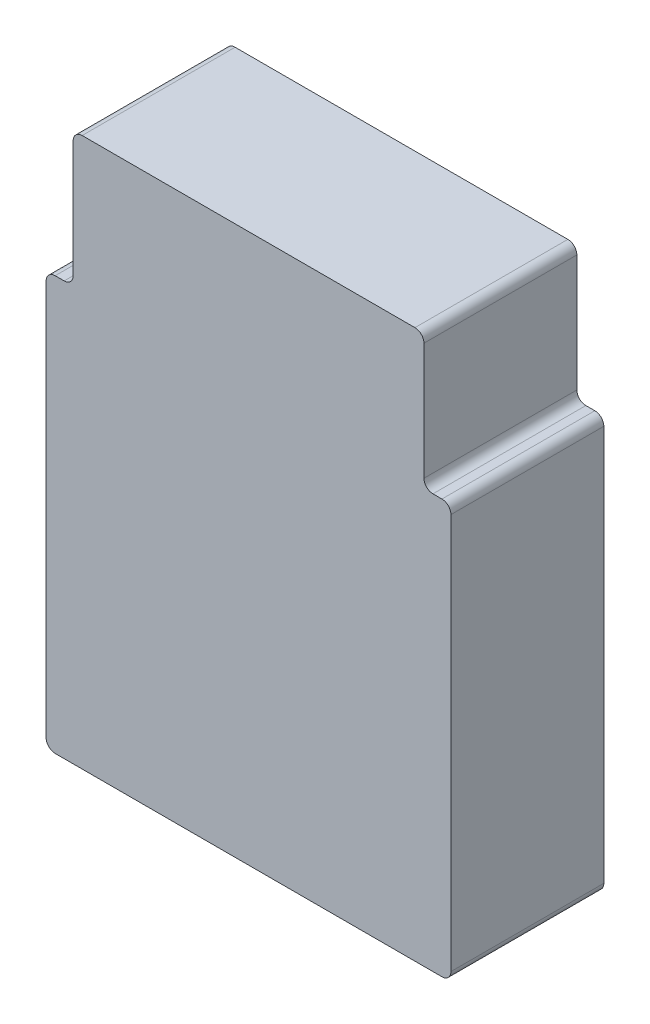
ISO-10303-21;
HEADER;
FILE_DESCRIPTION(('STEP AP214'),'2;1');
FILE_NAME('part.step','',(''),(''),'','','');
FILE_SCHEMA(('AUTOMOTIVE_DESIGN { 1 0 10303 214 1 1 1 1 }'));
ENDSEC;
DATA;
#1=APPLICATION_CONTEXT('core data for automotive mechanical design processes');
#2=APPLICATION_PROTOCOL_DEFINITION('international standard','automotive_design',2000,#1);
#3=PRODUCT_CONTEXT('',#1,'mechanical');
#4=PRODUCT('Part','Part','',(#3));
#5=PRODUCT_RELATED_PRODUCT_CATEGORY('part','',(#4));
#6=PRODUCT_DEFINITION_FORMATION('','',#4);
#7=PRODUCT_DEFINITION_CONTEXT('part definition',#1,'design');
#8=PRODUCT_DEFINITION('design','',#6,#7);
#9=PRODUCT_DEFINITION_SHAPE('','',#8);
#10=(LENGTH_UNIT() NAMED_UNIT(*) SI_UNIT(.MILLI.,.METRE.));
#11=(NAMED_UNIT(*) PLANE_ANGLE_UNIT() SI_UNIT($,.RADIAN.));
#12=(NAMED_UNIT(*) SI_UNIT($,.STERADIAN.) SOLID_ANGLE_UNIT());
#13=UNCERTAINTY_MEASURE_WITH_UNIT(LENGTH_MEASURE(1.E-05),#10,'distance_accuracy_value','');
#14=(GEOMETRIC_REPRESENTATION_CONTEXT(3) GLOBAL_UNCERTAINTY_ASSIGNED_CONTEXT((#13)) GLOBAL_UNIT_ASSIGNED_CONTEXT((#10,
#11,#12)) REPRESENTATION_CONTEXT('',''));
#15=CARTESIAN_POINT('',(0.,0.,0.));
#16=DIRECTION('',(0.,0.,1.));
#17=DIRECTION('',(1.,0.,0.));
#18=AXIS2_PLACEMENT_3D('',#15,#16,#17);
#19=CARTESIAN_POINT('',(1.95,0.,0.85));
#20=DIRECTION('',(1.,0.,0.));
#21=DIRECTION('',(0.,0.,-1.));
#22=AXIS2_PLACEMENT_3D('',#19,#20,#21);
#23=PLANE('',#22);
#24=DIRECTION('',(0.,-1.,0.));
#25=VECTOR('',#24,1.);
#26=CARTESIAN_POINT('',(1.95,0.,0.85));
#27=LINE('',#26,#25);
#28=CARTESIAN_POINT('',(1.95,0.65,0.85));
#29=VERTEX_POINT('',#28);
#30=CARTESIAN_POINT('',(1.95,-0.650000000000001,0.85));
#31=VERTEX_POINT('',#30);
#32=EDGE_CURVE('E293',#29,#31,#27,.T.);
#33=ORIENTED_EDGE('',*,*,#32,.T.);
#34=DIRECTION('',(0.,0.,-1.));
#35=VECTOR('',#34,1.);
#36=CARTESIAN_POINT('',(1.95,-0.650000000000001,-0.85));
#37=LINE('',#36,#35);
#38=CARTESIAN_POINT('',(1.95,-0.650000000000001,-0.85));
#39=VERTEX_POINT('',#38);
#40=EDGE_CURVE('E177',#31,#39,#37,.T.);
#41=ORIENTED_EDGE('',*,*,#40,.T.);
#42=DIRECTION('',(0.,-1.,0.));
#43=VECTOR('',#42,1.);
#44=CARTESIAN_POINT('',(1.95,0.,-0.85));
#45=LINE('',#44,#43);
#46=CARTESIAN_POINT('',(1.95,0.65,-0.85));
#47=VERTEX_POINT('',#46);
#48=EDGE_CURVE('E161',#47,#39,#45,.T.);
#49=ORIENTED_EDGE('',*,*,#48,.F.);
#50=DIRECTION('',(0.,0.,-1.));
#51=VECTOR('',#50,1.);
#52=CARTESIAN_POINT('',(1.95,0.65,0.85));
#53=LINE('',#52,#51);
#54=EDGE_CURVE('E174',#47,#29,#53,.F.);
#55=ORIENTED_EDGE('',*,*,#54,.T.);
#56=EDGE_LOOP('',(#33,#41,#49,#55));
#57=FACE_BOUND('',#56,.T.);
#58=ADVANCED_FACE('F43',(#57),#23,.T.);
#59=CARTESIAN_POINT('',(0.,0.75,0.85));
#60=DIRECTION('',(0.,1.,0.));
#61=DIRECTION('',(0.,0.,1.));
#62=AXIS2_PLACEMENT_3D('',#59,#60,#61);
#63=PLANE('',#62);
#64=DIRECTION('',(1.,0.,0.));
#65=VECTOR('',#64,1.);
#66=CARTESIAN_POINT('',(0.,0.75,-0.85));
#67=LINE('',#66,#65);
#68=CARTESIAN_POINT('',(-1.85,0.75,-0.85));
#69=VERTEX_POINT('',#68);
#70=CARTESIAN_POINT('',(1.85,0.75,-0.85));
#71=VERTEX_POINT('',#70);
#72=EDGE_CURVE('E163',#69,#71,#67,.T.);
#73=ORIENTED_EDGE('',*,*,#72,.F.);
#74=DIRECTION('',(0.,0.,-1.));
#75=VECTOR('',#74,1.);
#76=CARTESIAN_POINT('',(-1.85,0.75,0.85));
#77=LINE('',#76,#75);
#78=CARTESIAN_POINT('',(-1.85,0.75,0.85));
#79=VERTEX_POINT('',#78);
#80=EDGE_CURVE('E241',#69,#79,#77,.F.);
#81=ORIENTED_EDGE('',*,*,#80,.T.);
#82=DIRECTION('',(1.,0.,0.));
#83=VECTOR('',#82,1.);
#84=CARTESIAN_POINT('',(0.,0.75,0.85));
#85=LINE('',#84,#83);
#86=CARTESIAN_POINT('',(1.85,0.75,0.85));
#87=VERTEX_POINT('',#86);
#88=EDGE_CURVE('E276',#79,#87,#85,.T.);
#89=ORIENTED_EDGE('',*,*,#88,.T.);
#90=DIRECTION('',(0.,0.,-1.));
#91=VECTOR('',#90,1.);
#92=CARTESIAN_POINT('',(1.85,0.75,0.85));
#93=LINE('',#92,#91);
#94=EDGE_CURVE('E239',#87,#71,#93,.T.);
#95=ORIENTED_EDGE('',*,*,#94,.T.);
#96=EDGE_LOOP('',(#73,#81,#89,#95));
#97=FACE_BOUND('',#96,.T.);
#98=ADVANCED_FACE('F299',(#97),#63,.T.);
#99=CARTESIAN_POINT('',(-1.95,0.,0.85));
#100=DIRECTION('',(1.,0.,0.));
#101=DIRECTION('',(0.,0.,-1.));
#102=AXIS2_PLACEMENT_3D('',#99,#100,#101);
#103=PLANE('',#102);
#104=DIRECTION('',(0.,-1.,0.));
#105=VECTOR('',#104,1.);
#106=CARTESIAN_POINT('',(-1.95,0.,-0.85));
#107=LINE('',#106,#105);
#108=CARTESIAN_POINT('',(-1.95,0.65,-0.85));
#109=VERTEX_POINT('',#108);
#110=CARTESIAN_POINT('',(-1.95,-0.65,-0.85));
#111=VERTEX_POINT('',#110);
#112=EDGE_CURVE('E249',#109,#111,#107,.T.);
#113=ORIENTED_EDGE('',*,*,#112,.T.);
#114=DIRECTION('',(0.,0.,-1.));
#115=VECTOR('',#114,1.);
#116=CARTESIAN_POINT('',(-1.95,-0.65,0.85));
#117=LINE('',#116,#115);
#118=CARTESIAN_POINT('',(-1.95,-0.65,0.85));
#119=VERTEX_POINT('',#118);
#120=EDGE_CURVE('E237',#111,#119,#117,.F.);
#121=ORIENTED_EDGE('',*,*,#120,.T.);
#122=DIRECTION('',(0.,-1.,0.));
#123=VECTOR('',#122,1.);
#124=CARTESIAN_POINT('',(-1.95,0.,0.85));
#125=LINE('',#124,#123);
#126=CARTESIAN_POINT('',(-1.95,0.65,0.85));
#127=VERTEX_POINT('',#126);
#128=EDGE_CURVE('E268',#127,#119,#125,.T.);
#129=ORIENTED_EDGE('',*,*,#128,.F.);
#130=DIRECTION('',(0.,0.,-1.));
#131=VECTOR('',#130,1.);
#132=CARTESIAN_POINT('',(-1.95,0.65,-0.85));
#133=LINE('',#132,#131);
#134=EDGE_CURVE('E234',#127,#109,#133,.T.);
#135=ORIENTED_EDGE('',*,*,#134,.T.);
#136=EDGE_LOOP('',(#113,#121,#129,#135));
#137=FACE_BOUND('',#136,.T.);
#138=ADVANCED_FACE('F256',(#137),#103,.F.);
#139=CARTESIAN_POINT('',(0.,-0.750000000000001,0.85));
#140=DIRECTION('',(0.,1.,0.));
#141=DIRECTION('',(-1.,0.,0.));
#142=AXIS2_PLACEMENT_3D('',#139,#140,#141);
#143=PLANE('',#142);
#144=DIRECTION('',(1.,0.,0.));
#145=VECTOR('',#144,1.);
#146=CARTESIAN_POINT('',(0.,-0.750000000000001,-0.85));
#147=LINE('',#146,#145);
#148=CARTESIAN_POINT('',(-2.15,-0.750000000000001,-0.85));
#149=VERTEX_POINT('',#148);
#150=CARTESIAN_POINT('',(-2.05,-0.750000000000001,-0.85));
#151=VERTEX_POINT('',#150);
#152=EDGE_CURVE('E251',#149,#151,#147,.T.);
#153=ORIENTED_EDGE('',*,*,#152,.F.);
#154=DIRECTION('',(0.,0.,-1.));
#155=VECTOR('',#154,1.);
#156=CARTESIAN_POINT('',(-2.15,-0.750000000000001,0.85));
#157=LINE('',#156,#155);
#158=CARTESIAN_POINT('',(-2.15,-0.750000000000001,0.85));
#159=VERTEX_POINT('',#158);
#160=EDGE_CURVE('E232',#149,#159,#157,.F.);
#161=ORIENTED_EDGE('',*,*,#160,.T.);
#162=DIRECTION('',(1.,0.,0.));
#163=VECTOR('',#162,1.);
#164=CARTESIAN_POINT('',(0.,-0.750000000000001,0.85));
#165=LINE('',#164,#163);
#166=CARTESIAN_POINT('',(-2.05,-0.750000000000001,0.85));
#167=VERTEX_POINT('',#166);
#168=EDGE_CURVE('E188',#159,#167,#165,.T.);
#169=ORIENTED_EDGE('',*,*,#168,.T.);
#170=DIRECTION('',(0.,0.,-1.));
#171=VECTOR('',#170,1.);
#172=CARTESIAN_POINT('',(-2.05,-0.750000000000001,0.85));
#173=LINE('',#172,#171);
#174=EDGE_CURVE('E229',#167,#151,#173,.T.);
#175=ORIENTED_EDGE('',*,*,#174,.T.);
#176=EDGE_LOOP('',(#153,#161,#169,#175));
#177=FACE_BOUND('',#176,.T.);
#178=ADVANCED_FACE('F270',(#177),#143,.T.);
#179=CARTESIAN_POINT('',(-2.25,0.,0.85));
#180=DIRECTION('',(-1.,0.,0.));
#181=DIRECTION('',(0.,0.,1.));
#182=AXIS2_PLACEMENT_3D('',#179,#180,#181);
#183=PLANE('',#182);
#184=DIRECTION('',(0.,1.,0.));
#185=VECTOR('',#184,1.);
#186=CARTESIAN_POINT('',(-2.25,0.,-0.85));
#187=LINE('',#186,#185);
#188=CARTESIAN_POINT('',(-2.25,-5.25,-0.85));
#189=VERTEX_POINT('',#188);
#190=CARTESIAN_POINT('',(-2.25,-0.850000000000001,-0.85));
#191=VERTEX_POINT('',#190);
#192=EDGE_CURVE('E284',#189,#191,#187,.T.);
#193=ORIENTED_EDGE('',*,*,#192,.F.);
#194=DIRECTION('',(0.,0.,-1.));
#195=VECTOR('',#194,1.);
#196=CARTESIAN_POINT('',(-2.25,-5.25,0.85));
#197=LINE('',#196,#195);
#198=CARTESIAN_POINT('',(-2.25,-5.25,0.85));
#199=VERTEX_POINT('',#198);
#200=EDGE_CURVE('E227',#189,#199,#197,.F.);
#201=ORIENTED_EDGE('',*,*,#200,.T.);
#202=DIRECTION('',(0.,1.,0.));
#203=VECTOR('',#202,1.);
#204=CARTESIAN_POINT('',(-2.25,0.,0.85));
#205=LINE('',#204,#203);
#206=CARTESIAN_POINT('',(-2.25,-0.850000000000001,0.85));
#207=VERTEX_POINT('',#206);
#208=EDGE_CURVE('E272',#199,#207,#205,.T.);
#209=ORIENTED_EDGE('',*,*,#208,.T.);
#210=DIRECTION('',(0.,0.,-1.));
#211=VECTOR('',#210,1.);
#212=CARTESIAN_POINT('',(-2.25,-0.850000000000001,0.85));
#213=LINE('',#212,#211);
#214=EDGE_CURVE('E224',#207,#191,#213,.T.);
#215=ORIENTED_EDGE('',*,*,#214,.T.);
#216=EDGE_LOOP('',(#193,#201,#209,#215));
#217=FACE_BOUND('',#216,.T.);
#218=ADVANCED_FACE('F342',(#217),#183,.T.);
#219=CARTESIAN_POINT('',(0.,-5.35,0.85));
#220=DIRECTION('',(0.,1.,0.));
#221=DIRECTION('',(-1.,0.,0.));
#222=AXIS2_PLACEMENT_3D('',#219,#220,#221);
#223=PLANE('',#222);
#224=DIRECTION('',(1.,0.,0.));
#225=VECTOR('',#224,1.);
#226=CARTESIAN_POINT('',(0.,-5.35,-0.85));
#227=LINE('',#226,#225);
#228=CARTESIAN_POINT('',(-2.15,-5.35,-0.85));
#229=VERTEX_POINT('',#228);
#230=CARTESIAN_POINT('',(2.15,-5.35,-0.85));
#231=VERTEX_POINT('',#230);
#232=EDGE_CURVE('E287',#229,#231,#227,.T.);
#233=ORIENTED_EDGE('',*,*,#232,.T.);
#234=DIRECTION('',(0.,0.,-1.));
#235=VECTOR('',#234,1.);
#236=CARTESIAN_POINT('',(2.15,-5.35,0.85));
#237=LINE('',#236,#235);
#238=CARTESIAN_POINT('',(2.15,-5.35,0.85));
#239=VERTEX_POINT('',#238);
#240=EDGE_CURVE('E58',#231,#239,#237,.F.);
#241=ORIENTED_EDGE('',*,*,#240,.T.);
#242=DIRECTION('',(1.,0.,0.));
#243=VECTOR('',#242,1.);
#244=CARTESIAN_POINT('',(0.,-5.35,0.85));
#245=LINE('',#244,#243);
#246=CARTESIAN_POINT('',(-2.15,-5.35,0.85));
#247=VERTEX_POINT('',#246);
#248=EDGE_CURVE('E274',#247,#239,#245,.T.);
#249=ORIENTED_EDGE('',*,*,#248,.F.);
#250=DIRECTION('',(0.,0.,-1.));
#251=VECTOR('',#250,1.);
#252=CARTESIAN_POINT('',(-2.15,-5.35,-0.85));
#253=LINE('',#252,#251);
#254=EDGE_CURVE('E220',#247,#229,#253,.T.);
#255=ORIENTED_EDGE('',*,*,#254,.T.);
#256=EDGE_LOOP('',(#233,#241,#249,#255));
#257=FACE_BOUND('',#256,.T.);
#258=ADVANCED_FACE('F345',(#257),#223,.F.);
#259=CARTESIAN_POINT('',(2.25,0.,0.85));
#260=DIRECTION('',(-1.,0.,0.));
#261=DIRECTION('',(0.,0.,1.));
#262=AXIS2_PLACEMENT_3D('',#259,#260,#261);
#263=PLANE('',#262);
#264=DIRECTION('',(0.,1.,0.));
#265=VECTOR('',#264,1.);
#266=CARTESIAN_POINT('',(2.25,0.,-0.85));
#267=LINE('',#266,#265);
#268=CARTESIAN_POINT('',(2.25,-5.25,-0.85));
#269=VERTEX_POINT('',#268);
#270=CARTESIAN_POINT('',(2.25,-0.850000000000001,-0.85));
#271=VERTEX_POINT('',#270);
#272=EDGE_CURVE('E190',#269,#271,#267,.T.);
#273=ORIENTED_EDGE('',*,*,#272,.T.);
#274=DIRECTION('',(0.,0.,-1.));
#275=VECTOR('',#274,1.);
#276=CARTESIAN_POINT('',(2.25,-0.850000000000001,0.85));
#277=LINE('',#276,#275);
#278=CARTESIAN_POINT('',(2.25,-0.850000000000001,0.85));
#279=VERTEX_POINT('',#278);
#280=EDGE_CURVE('E208',#271,#279,#277,.F.);
#281=ORIENTED_EDGE('',*,*,#280,.T.);
#282=DIRECTION('',(0.,1.,0.));
#283=VECTOR('',#282,1.);
#284=CARTESIAN_POINT('',(2.25,0.,0.85));
#285=LINE('',#284,#283);
#286=CARTESIAN_POINT('',(2.25,-5.25,0.85));
#287=VERTEX_POINT('',#286);
#288=EDGE_CURVE('E186',#287,#279,#285,.T.);
#289=ORIENTED_EDGE('',*,*,#288,.F.);
#290=DIRECTION('',(0.,0.,-1.));
#291=VECTOR('',#290,1.);
#292=CARTESIAN_POINT('',(2.25,-5.25,0.85));
#293=LINE('',#292,#291);
#294=EDGE_CURVE('E205',#287,#269,#293,.T.);
#295=ORIENTED_EDGE('',*,*,#294,.T.);
#296=EDGE_LOOP('',(#273,#281,#289,#295));
#297=FACE_BOUND('',#296,.T.);
#298=ADVANCED_FACE('F349',(#297),#263,.F.);
#299=CARTESIAN_POINT('',(2.05,-0.750000000000001,-0.85));
#300=VERTEX_POINT('',#299);
#301=CARTESIAN_POINT('',(2.15,-0.750000000000001,-0.85));
#302=VERTEX_POINT('',#301);
#303=EDGE_CURVE('E285',#300,#302,#147,.T.);
#304=ORIENTED_EDGE('',*,*,#303,.F.);
#305=DIRECTION('',(0.,0.,-1.));
#306=VECTOR('',#305,1.);
#307=CARTESIAN_POINT('',(2.05,-0.750000000000001,0.85));
#308=LINE('',#307,#306);
#309=CARTESIAN_POINT('',(2.05,-0.750000000000001,0.85));
#310=VERTEX_POINT('',#309);
#311=EDGE_CURVE('E169',#300,#310,#308,.F.);
#312=ORIENTED_EDGE('',*,*,#311,.T.);
#313=CARTESIAN_POINT('',(2.15,-0.750000000000001,0.85));
#314=VERTEX_POINT('',#313);
#315=EDGE_CURVE('E181',#310,#314,#165,.T.);
#316=ORIENTED_EDGE('',*,*,#315,.T.);
#317=DIRECTION('',(0.,0.,-1.));
#318=VECTOR('',#317,1.);
#319=CARTESIAN_POINT('',(2.15,-0.750000000000001,-0.85));
#320=LINE('',#319,#318);
#321=EDGE_CURVE('E183',#314,#302,#320,.T.);
#322=ORIENTED_EDGE('',*,*,#321,.T.);
#323=EDGE_LOOP('',(#304,#312,#316,#322));
#324=FACE_BOUND('',#323,.T.);
#325=ADVANCED_FACE('F354',(#324),#143,.T.);
#326=CARTESIAN_POINT('',(0.,0.,0.85));
#327=DIRECTION('',(0.,0.,1.));
#328=DIRECTION('',(1.,0.,0.));
#329=AXIS2_PLACEMENT_3D('',#326,#327,#328);
#330=PLANE('',#329);
#331=ORIENTED_EDGE('',*,*,#288,.T.);
#332=CARTESIAN_POINT('',(2.15,-0.850000000000001,0.85));
#333=DIRECTION('',(0.,0.,1.));
#334=DIRECTION('',(1.,0.,0.));
#335=AXIS2_PLACEMENT_3D('',#332,#333,#334);
#336=CIRCLE('',#335,0.1);
#337=EDGE_CURVE('E218',#279,#314,#336,.T.);
#338=ORIENTED_EDGE('',*,*,#337,.T.);
#339=ORIENTED_EDGE('',*,*,#315,.F.);
#340=CARTESIAN_POINT('',(2.05,-0.650000000000001,0.85));
#341=DIRECTION('',(0.,0.,1.));
#342=DIRECTION('',(1.,0.,0.));
#343=AXIS2_PLACEMENT_3D('',#340,#341,#342);
#344=CIRCLE('',#343,0.1);
#345=EDGE_CURVE('E245',#310,#31,#344,.F.);
#346=ORIENTED_EDGE('',*,*,#345,.T.);
#347=ORIENTED_EDGE('',*,*,#32,.F.);
#348=CARTESIAN_POINT('',(1.85,0.65,0.85));
#349=DIRECTION('',(0.,0.,1.));
#350=DIRECTION('',(1.,0.,0.));
#351=AXIS2_PLACEMENT_3D('',#348,#349,#350);
#352=CIRCLE('',#351,0.1);
#353=EDGE_CURVE('E180',#29,#87,#352,.T.);
#354=ORIENTED_EDGE('',*,*,#353,.T.);
#355=ORIENTED_EDGE('',*,*,#88,.F.);
#356=CARTESIAN_POINT('',(-1.85,0.65,0.85));
#357=DIRECTION('',(0.,0.,1.));
#358=DIRECTION('',(1.,0.,0.));
#359=AXIS2_PLACEMENT_3D('',#356,#357,#358);
#360=CIRCLE('',#359,0.1);
#361=EDGE_CURVE('E211',#79,#127,#360,.T.);
#362=ORIENTED_EDGE('',*,*,#361,.T.);
#363=ORIENTED_EDGE('',*,*,#128,.T.);
#364=CARTESIAN_POINT('',(-2.05,-0.65,0.85));
#365=DIRECTION('',(0.,0.,1.));
#366=DIRECTION('',(1.,0.,0.));
#367=AXIS2_PLACEMENT_3D('',#364,#365,#366);
#368=CIRCLE('',#367,0.1);
#369=EDGE_CURVE('E11',#119,#167,#368,.F.);
#370=ORIENTED_EDGE('',*,*,#369,.T.);
#371=ORIENTED_EDGE('',*,*,#168,.F.);
#372=CARTESIAN_POINT('',(-2.15,-0.850000000000001,0.85));
#373=DIRECTION('',(0.,0.,1.));
#374=DIRECTION('',(1.,0.,0.));
#375=AXIS2_PLACEMENT_3D('',#372,#373,#374);
#376=CIRCLE('',#375,0.1);
#377=EDGE_CURVE('E213',#159,#207,#376,.T.);
#378=ORIENTED_EDGE('',*,*,#377,.T.);
#379=ORIENTED_EDGE('',*,*,#208,.F.);
#380=CARTESIAN_POINT('',(-2.15,-5.25,0.85));
#381=DIRECTION('',(0.,0.,1.));
#382=DIRECTION('',(1.,0.,0.));
#383=AXIS2_PLACEMENT_3D('',#380,#381,#382);
#384=CIRCLE('',#383,0.1);
#385=EDGE_CURVE('E65',#199,#247,#384,.T.);
#386=ORIENTED_EDGE('',*,*,#385,.T.);
#387=ORIENTED_EDGE('',*,*,#248,.T.);
#388=CARTESIAN_POINT('',(2.15,-5.25,0.85));
#389=DIRECTION('',(0.,0.,1.));
#390=DIRECTION('',(1.,0.,0.));
#391=AXIS2_PLACEMENT_3D('',#388,#389,#390);
#392=CIRCLE('',#391,0.1);
#393=EDGE_CURVE('E216',#239,#287,#392,.T.);
#394=ORIENTED_EDGE('',*,*,#393,.T.);
#395=EDGE_LOOP('',(#331,#338,#339,#346,#347,#354,#355,#362,#363,#370,#371,#378,#379,#386,#387,#394));
#396=FACE_BOUND('',#395,.T.);
#397=ADVANCED_FACE('F266',(#396),#330,.T.);
#398=CARTESIAN_POINT('',(0.,0.,-0.85));
#399=DIRECTION('',(0.,0.,1.));
#400=DIRECTION('',(1.,0.,0.));
#401=AXIS2_PLACEMENT_3D('',#398,#399,#400);
#402=PLANE('',#401);
#403=ORIENTED_EDGE('',*,*,#303,.T.);
#404=CARTESIAN_POINT('',(2.15,-0.850000000000001,-0.85));
#405=DIRECTION('',(0.,0.,1.));
#406=DIRECTION('',(1.,0.,0.));
#407=AXIS2_PLACEMENT_3D('',#404,#405,#406);
#408=CIRCLE('',#407,0.1);
#409=EDGE_CURVE('E203',#302,#271,#408,.F.);
#410=ORIENTED_EDGE('',*,*,#409,.T.);
#411=ORIENTED_EDGE('',*,*,#272,.F.);
#412=CARTESIAN_POINT('',(2.15,-5.25,-0.85));
#413=DIRECTION('',(0.,0.,1.));
#414=DIRECTION('',(1.,0.,0.));
#415=AXIS2_PLACEMENT_3D('',#412,#413,#414);
#416=CIRCLE('',#415,0.1);
#417=EDGE_CURVE('E201',#269,#231,#416,.F.);
#418=ORIENTED_EDGE('',*,*,#417,.T.);
#419=ORIENTED_EDGE('',*,*,#232,.F.);
#420=CARTESIAN_POINT('',(-2.15,-5.25,-0.85));
#421=DIRECTION('',(0.,0.,1.));
#422=DIRECTION('',(1.,0.,0.));
#423=AXIS2_PLACEMENT_3D('',#420,#421,#422);
#424=CIRCLE('',#423,0.1);
#425=EDGE_CURVE('E199',#229,#189,#424,.F.);
#426=ORIENTED_EDGE('',*,*,#425,.T.);
#427=ORIENTED_EDGE('',*,*,#192,.T.);
#428=CARTESIAN_POINT('',(-2.15,-0.850000000000001,-0.85));
#429=DIRECTION('',(0.,0.,1.));
#430=DIRECTION('',(1.,0.,0.));
#431=AXIS2_PLACEMENT_3D('',#428,#429,#430);
#432=CIRCLE('',#431,0.1);
#433=EDGE_CURVE('E197',#191,#149,#432,.F.);
#434=ORIENTED_EDGE('',*,*,#433,.T.);
#435=ORIENTED_EDGE('',*,*,#152,.T.);
#436=CARTESIAN_POINT('',(-2.05,-0.65,-0.85));
#437=DIRECTION('',(0.,0.,1.));
#438=DIRECTION('',(1.,0.,0.));
#439=AXIS2_PLACEMENT_3D('',#436,#437,#438);
#440=CIRCLE('',#439,0.1);
#441=EDGE_CURVE('E51',#151,#111,#440,.T.);
#442=ORIENTED_EDGE('',*,*,#441,.T.);
#443=ORIENTED_EDGE('',*,*,#112,.F.);
#444=CARTESIAN_POINT('',(-1.85,0.65,-0.85));
#445=DIRECTION('',(0.,0.,1.));
#446=DIRECTION('',(1.,0.,0.));
#447=AXIS2_PLACEMENT_3D('',#444,#445,#446);
#448=CIRCLE('',#447,0.1);
#449=EDGE_CURVE('E168',#109,#69,#448,.F.);
#450=ORIENTED_EDGE('',*,*,#449,.T.);
#451=ORIENTED_EDGE('',*,*,#72,.T.);
#452=CARTESIAN_POINT('',(1.85,0.65,-0.85));
#453=DIRECTION('',(0.,0.,1.));
#454=DIRECTION('',(1.,0.,0.));
#455=AXIS2_PLACEMENT_3D('',#452,#453,#454);
#456=CIRCLE('',#455,0.1);
#457=EDGE_CURVE('E157',#71,#47,#456,.F.);
#458=ORIENTED_EDGE('',*,*,#457,.T.);
#459=ORIENTED_EDGE('',*,*,#48,.T.);
#460=CARTESIAN_POINT('',(2.05,-0.650000000000001,-0.85));
#461=DIRECTION('',(0.,0.,1.));
#462=DIRECTION('',(1.,0.,0.));
#463=AXIS2_PLACEMENT_3D('',#460,#461,#462);
#464=CIRCLE('',#463,0.1);
#465=EDGE_CURVE('E243',#39,#300,#464,.T.);
#466=ORIENTED_EDGE('',*,*,#465,.T.);
#467=EDGE_LOOP('',(#403,#410,#411,#418,#419,#426,#427,#434,#435,#442,#443,#450,#451,#458,#459,#466));
#468=FACE_BOUND('',#467,.T.);
#469=ADVANCED_FACE('F160',(#468),#402,.F.);
#470=CARTESIAN_POINT('',(2.05,-0.650000000000001,0.85));
#471=DIRECTION('',(0.,0.,1.));
#472=DIRECTION('',(1.,0.,0.));
#473=AXIS2_PLACEMENT_3D('',#470,#471,#472);
#474=CYLINDRICAL_SURFACE('',#473,0.1);
#475=ORIENTED_EDGE('',*,*,#345,.F.);
#476=ORIENTED_EDGE('',*,*,#311,.F.);
#477=ORIENTED_EDGE('',*,*,#465,.F.);
#478=ORIENTED_EDGE('',*,*,#40,.F.);
#479=EDGE_LOOP('',(#475,#476,#477,#478));
#480=FACE_BOUND('',#479,.T.);
#481=ADVANCED_FACE('F319',(#480),#474,.F.);
#482=CARTESIAN_POINT('',(2.15,-0.850000000000001,0.85));
#483=DIRECTION('',(0.,0.,1.));
#484=DIRECTION('',(1.,0.,0.));
#485=AXIS2_PLACEMENT_3D('',#482,#483,#484);
#486=CYLINDRICAL_SURFACE('',#485,0.1);
#487=ORIENTED_EDGE('',*,*,#337,.F.);
#488=ORIENTED_EDGE('',*,*,#280,.F.);
#489=ORIENTED_EDGE('',*,*,#409,.F.);
#490=ORIENTED_EDGE('',*,*,#321,.F.);
#491=EDGE_LOOP('',(#487,#488,#489,#490));
#492=FACE_BOUND('',#491,.T.);
#493=ADVANCED_FACE('F322',(#492),#486,.T.);
#494=CARTESIAN_POINT('',(2.15,-5.25,0.85));
#495=DIRECTION('',(0.,0.,-1.));
#496=DIRECTION('',(-1.,0.,0.));
#497=AXIS2_PLACEMENT_3D('',#494,#495,#496);
#498=CYLINDRICAL_SURFACE('',#497,0.1);
#499=ORIENTED_EDGE('',*,*,#393,.F.);
#500=ORIENTED_EDGE('',*,*,#240,.F.);
#501=ORIENTED_EDGE('',*,*,#417,.F.);
#502=ORIENTED_EDGE('',*,*,#294,.F.);
#503=EDGE_LOOP('',(#499,#500,#501,#502));
#504=FACE_BOUND('',#503,.T.);
#505=ADVANCED_FACE('F326',(#504),#498,.T.);
#506=CARTESIAN_POINT('',(-2.15,-5.25,0.85));
#507=DIRECTION('',(0.,0.,1.));
#508=DIRECTION('',(1.,0.,0.));
#509=AXIS2_PLACEMENT_3D('',#506,#507,#508);
#510=CYLINDRICAL_SURFACE('',#509,0.1);
#511=ORIENTED_EDGE('',*,*,#385,.F.);
#512=ORIENTED_EDGE('',*,*,#200,.F.);
#513=ORIENTED_EDGE('',*,*,#425,.F.);
#514=ORIENTED_EDGE('',*,*,#254,.F.);
#515=EDGE_LOOP('',(#511,#512,#513,#514));
#516=FACE_BOUND('',#515,.T.);
#517=ADVANCED_FACE('F330',(#516),#510,.T.);
#518=CARTESIAN_POINT('',(-2.15,-0.850000000000001,0.85));
#519=DIRECTION('',(0.,0.,-1.));
#520=DIRECTION('',(-1.,0.,0.));
#521=AXIS2_PLACEMENT_3D('',#518,#519,#520);
#522=CYLINDRICAL_SURFACE('',#521,0.1);
#523=ORIENTED_EDGE('',*,*,#377,.F.);
#524=ORIENTED_EDGE('',*,*,#160,.F.);
#525=ORIENTED_EDGE('',*,*,#433,.F.);
#526=ORIENTED_EDGE('',*,*,#214,.F.);
#527=EDGE_LOOP('',(#523,#524,#525,#526));
#528=FACE_BOUND('',#527,.T.);
#529=ADVANCED_FACE('F309',(#528),#522,.T.);
#530=CARTESIAN_POINT('',(-2.05,-0.65,0.85));
#531=DIRECTION('',(0.,0.,-1.));
#532=DIRECTION('',(-1.,0.,0.));
#533=AXIS2_PLACEMENT_3D('',#530,#531,#532);
#534=CYLINDRICAL_SURFACE('',#533,0.1);
#535=ORIENTED_EDGE('',*,*,#369,.F.);
#536=ORIENTED_EDGE('',*,*,#120,.F.);
#537=ORIENTED_EDGE('',*,*,#441,.F.);
#538=ORIENTED_EDGE('',*,*,#174,.F.);
#539=EDGE_LOOP('',(#535,#536,#537,#538));
#540=FACE_BOUND('',#539,.T.);
#541=ADVANCED_FACE('F262',(#540),#534,.F.);
#542=CARTESIAN_POINT('',(-1.85,0.65,0.85));
#543=DIRECTION('',(0.,0.,1.));
#544=DIRECTION('',(1.,0.,0.));
#545=AXIS2_PLACEMENT_3D('',#542,#543,#544);
#546=CYLINDRICAL_SURFACE('',#545,0.1);
#547=ORIENTED_EDGE('',*,*,#361,.F.);
#548=ORIENTED_EDGE('',*,*,#80,.F.);
#549=ORIENTED_EDGE('',*,*,#449,.F.);
#550=ORIENTED_EDGE('',*,*,#134,.F.);
#551=EDGE_LOOP('',(#547,#548,#549,#550));
#552=FACE_BOUND('',#551,.T.);
#553=ADVANCED_FACE('F303',(#552),#546,.T.);
#554=CARTESIAN_POINT('',(1.85,0.65,0.85));
#555=DIRECTION('',(0.,0.,-1.));
#556=DIRECTION('',(-1.,0.,0.));
#557=AXIS2_PLACEMENT_3D('',#554,#555,#556);
#558=CYLINDRICAL_SURFACE('',#557,0.1);
#559=ORIENTED_EDGE('',*,*,#353,.F.);
#560=ORIENTED_EDGE('',*,*,#54,.F.);
#561=ORIENTED_EDGE('',*,*,#457,.F.);
#562=ORIENTED_EDGE('',*,*,#94,.F.);
#563=EDGE_LOOP('',(#559,#560,#561,#562));
#564=FACE_BOUND('',#563,.T.);
#565=ADVANCED_FACE('F45',(#564),#558,.T.);
#566=CLOSED_SHELL('',(#58,#98,#138,#178,#218,#258,#298,#325,#397,#469,#481,#493,#505,#517,#529,
#541,#553,#565));
#567=MANIFOLD_SOLID_BREP('B2',#566);
#568=ADVANCED_BREP_SHAPE_REPRESENTATION('',(#18,#567),#14);
#569=SHAPE_DEFINITION_REPRESENTATION(#9,#568);
ENDSEC;
END-ISO-10303-21;
